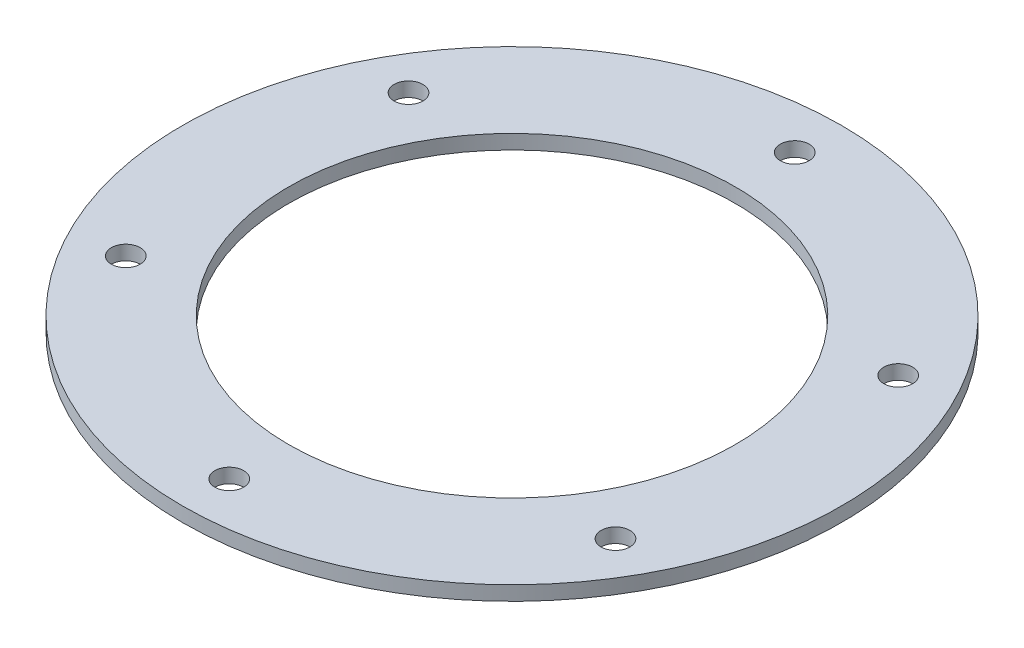
ISO-10303-21;
HEADER;
FILE_DESCRIPTION(('STEP AP214'),'2;1');
FILE_NAME('part.step','',(''),(''),'','','');
FILE_SCHEMA(('AUTOMOTIVE_DESIGN { 1 0 10303 214 1 1 1 1 }'));
ENDSEC;
DATA;
#1=APPLICATION_CONTEXT('core data for automotive mechanical design processes');
#2=APPLICATION_PROTOCOL_DEFINITION('international standard','automotive_design',2000,#1);
#3=PRODUCT_CONTEXT('',#1,'mechanical');
#4=PRODUCT('Part','Part','',(#3));
#5=PRODUCT_RELATED_PRODUCT_CATEGORY('part','',(#4));
#6=PRODUCT_DEFINITION_FORMATION('','',#4);
#7=PRODUCT_DEFINITION_CONTEXT('part definition',#1,'design');
#8=PRODUCT_DEFINITION('design','',#6,#7);
#9=PRODUCT_DEFINITION_SHAPE('','',#8);
#10=(LENGTH_UNIT() NAMED_UNIT(*) SI_UNIT(.MILLI.,.METRE.));
#11=(NAMED_UNIT(*) PLANE_ANGLE_UNIT() SI_UNIT($,.RADIAN.));
#12=(NAMED_UNIT(*) SI_UNIT($,.STERADIAN.) SOLID_ANGLE_UNIT());
#13=UNCERTAINTY_MEASURE_WITH_UNIT(LENGTH_MEASURE(1.E-05),#10,'distance_accuracy_value','');
#14=(GEOMETRIC_REPRESENTATION_CONTEXT(3) GLOBAL_UNCERTAINTY_ASSIGNED_CONTEXT((#13)) GLOBAL_UNIT_ASSIGNED_CONTEXT((#10,
#11,#12)) REPRESENTATION_CONTEXT('',''));
#15=CARTESIAN_POINT('',(0.,0.,0.));
#16=DIRECTION('',(0.,0.,1.));
#17=DIRECTION('',(1.,0.,0.));
#18=AXIS2_PLACEMENT_3D('',#15,#16,#17);
#19=CARTESIAN_POINT('',(0.,-1.,0.));
#20=DIRECTION('',(0.,1.,0.));
#21=DIRECTION('',(0.,0.,1.));
#22=AXIS2_PLACEMENT_3D('',#19,#20,#21);
#23=CYLINDRICAL_SURFACE('',#22,45.75);
#24=CARTESIAN_POINT('',(0.,-1.,0.));
#25=DIRECTION('',(0.,1.,0.));
#26=DIRECTION('',(0.,0.,1.));
#27=AXIS2_PLACEMENT_3D('',#24,#25,#26);
#28=CIRCLE('',#27,45.75);
#29=CARTESIAN_POINT('',(0.,-1.,45.75));
#30=VERTEX_POINT('',#29);
#31=EDGE_CURVE('E10',#30,#30,#28,.T.);
#32=ORIENTED_EDGE('',*,*,#31,.T.);
#33=EDGE_LOOP('',(#32));
#34=FACE_BOUND('',#33,.T.);
#35=CARTESIAN_POINT('',(0.,1.,0.));
#36=DIRECTION('',(0.,1.,0.));
#37=DIRECTION('',(0.,0.,1.));
#38=AXIS2_PLACEMENT_3D('',#35,#36,#37);
#39=CIRCLE('',#38,45.75);
#40=CARTESIAN_POINT('',(0.,1.,45.75));
#41=VERTEX_POINT('',#40);
#42=EDGE_CURVE('E40',#41,#41,#39,.T.);
#43=ORIENTED_EDGE('',*,*,#42,.F.);
#44=EDGE_LOOP('',(#43));
#45=FACE_BOUND('',#44,.T.);
#46=ADVANCED_FACE('F37',(#34,#45),#23,.T.);
#47=CARTESIAN_POINT('',(0.,-1.,0.));
#48=DIRECTION('',(0.,1.,0.));
#49=DIRECTION('',(0.,0.,1.));
#50=AXIS2_PLACEMENT_3D('',#47,#48,#49);
#51=PLANE('',#50);
#52=CARTESIAN_POINT('',(-33.9914970985392,-1.,-19.625));
#53=DIRECTION('',(0.,1.,0.));
#54=DIRECTION('',(0.,0.,1.));
#55=AXIS2_PLACEMENT_3D('',#52,#53,#54);
#56=CIRCLE('',#55,2.);
#57=CARTESIAN_POINT('',(-33.9914970985392,-1.,-17.625));
#58=VERTEX_POINT('',#57);
#59=EDGE_CURVE('E82',#58,#58,#56,.T.);
#60=ORIENTED_EDGE('',*,*,#59,.T.);
#61=EDGE_LOOP('',(#60));
#62=FACE_BOUND('',#61,.T.);
#63=CARTESIAN_POINT('',(-33.9914970985392,-1.,19.625));
#64=DIRECTION('',(0.,1.,0.));
#65=DIRECTION('',(0.,0.,1.));
#66=AXIS2_PLACEMENT_3D('',#63,#64,#65);
#67=CIRCLE('',#66,2.);
#68=CARTESIAN_POINT('',(-33.9914970985392,-1.,21.625));
#69=VERTEX_POINT('',#68);
#70=EDGE_CURVE('E76',#69,#69,#67,.T.);
#71=ORIENTED_EDGE('',*,*,#70,.T.);
#72=EDGE_LOOP('',(#71));
#73=FACE_BOUND('',#72,.T.);
#74=CARTESIAN_POINT('',(0.,-1.,39.25));
#75=DIRECTION('',(0.,1.,0.));
#76=DIRECTION('',(0.,0.,1.));
#77=AXIS2_PLACEMENT_3D('',#74,#75,#76);
#78=CIRCLE('',#77,2.);
#79=CARTESIAN_POINT('',(0.,-1.,41.25));
#80=VERTEX_POINT('',#79);
#81=EDGE_CURVE('E70',#80,#80,#78,.T.);
#82=ORIENTED_EDGE('',*,*,#81,.T.);
#83=EDGE_LOOP('',(#82));
#84=FACE_BOUND('',#83,.T.);
#85=CARTESIAN_POINT('',(33.9914970985392,-1.,19.625));
#86=DIRECTION('',(0.,1.,0.));
#87=DIRECTION('',(0.,0.,1.));
#88=AXIS2_PLACEMENT_3D('',#85,#86,#87);
#89=CIRCLE('',#88,2.);
#90=CARTESIAN_POINT('',(33.9914970985392,-1.,21.625));
#91=VERTEX_POINT('',#90);
#92=EDGE_CURVE('E64',#91,#91,#89,.T.);
#93=ORIENTED_EDGE('',*,*,#92,.T.);
#94=EDGE_LOOP('',(#93));
#95=FACE_BOUND('',#94,.T.);
#96=CARTESIAN_POINT('',(33.9914970985392,-1.,-19.625));
#97=DIRECTION('',(0.,1.,0.));
#98=DIRECTION('',(0.,0.,1.));
#99=AXIS2_PLACEMENT_3D('',#96,#97,#98);
#100=CIRCLE('',#99,2.);
#101=CARTESIAN_POINT('',(33.9914970985392,-1.,-17.625));
#102=VERTEX_POINT('',#101);
#103=EDGE_CURVE('E58',#102,#102,#100,.T.);
#104=ORIENTED_EDGE('',*,*,#103,.T.);
#105=EDGE_LOOP('',(#104));
#106=FACE_BOUND('',#105,.T.);
#107=CARTESIAN_POINT('',(0.,-1.,-39.25));
#108=DIRECTION('',(0.,1.,0.));
#109=DIRECTION('',(0.,0.,1.));
#110=AXIS2_PLACEMENT_3D('',#107,#108,#109);
#111=CIRCLE('',#110,2.);
#112=CARTESIAN_POINT('',(0.,-1.,-37.25));
#113=VERTEX_POINT('',#112);
#114=EDGE_CURVE('E52',#113,#113,#111,.T.);
#115=ORIENTED_EDGE('',*,*,#114,.T.);
#116=EDGE_LOOP('',(#115));
#117=FACE_BOUND('',#116,.T.);
#118=CARTESIAN_POINT('',(0.,-1.,0.));
#119=DIRECTION('',(0.,1.,0.));
#120=DIRECTION('',(0.,0.,1.));
#121=AXIS2_PLACEMENT_3D('',#118,#119,#120);
#122=CIRCLE('',#121,31.);
#123=CARTESIAN_POINT('',(0.,-1.,31.));
#124=VERTEX_POINT('',#123);
#125=EDGE_CURVE('E47',#124,#124,#122,.T.);
#126=ORIENTED_EDGE('',*,*,#125,.T.);
#127=EDGE_LOOP('',(#126));
#128=FACE_BOUND('',#127,.T.);
#129=ORIENTED_EDGE('',*,*,#31,.F.);
#130=EDGE_LOOP('',(#129));
#131=FACE_BOUND('',#130,.T.);
#132=ADVANCED_FACE('F91',(#62,#73,#84,#95,#106,#117,#128,#131),#51,.F.);
#133=CARTESIAN_POINT('',(0.,1.,0.));
#134=DIRECTION('',(0.,1.,0.));
#135=DIRECTION('',(0.,0.,1.));
#136=AXIS2_PLACEMENT_3D('',#133,#134,#135);
#137=PLANE('',#136);
#138=CARTESIAN_POINT('',(-33.9914970985392,1.,-19.625));
#139=DIRECTION('',(0.,1.,0.));
#140=DIRECTION('',(0.,0.,1.));
#141=AXIS2_PLACEMENT_3D('',#138,#139,#140);
#142=CIRCLE('',#141,2.);
#143=CARTESIAN_POINT('',(-33.9914970985392,1.,-17.625));
#144=VERTEX_POINT('',#143);
#145=EDGE_CURVE('E85',#144,#144,#142,.T.);
#146=ORIENTED_EDGE('',*,*,#145,.F.);
#147=EDGE_LOOP('',(#146));
#148=FACE_BOUND('',#147,.T.);
#149=CARTESIAN_POINT('',(-33.9914970985392,1.,19.625));
#150=DIRECTION('',(0.,1.,0.));
#151=DIRECTION('',(0.,0.,1.));
#152=AXIS2_PLACEMENT_3D('',#149,#150,#151);
#153=CIRCLE('',#152,2.);
#154=CARTESIAN_POINT('',(-33.9914970985392,1.,21.625));
#155=VERTEX_POINT('',#154);
#156=EDGE_CURVE('E79',#155,#155,#153,.T.);
#157=ORIENTED_EDGE('',*,*,#156,.F.);
#158=EDGE_LOOP('',(#157));
#159=FACE_BOUND('',#158,.T.);
#160=CARTESIAN_POINT('',(0.,1.,39.25));
#161=DIRECTION('',(0.,1.,0.));
#162=DIRECTION('',(0.,0.,1.));
#163=AXIS2_PLACEMENT_3D('',#160,#161,#162);
#164=CIRCLE('',#163,2.);
#165=CARTESIAN_POINT('',(0.,1.,41.25));
#166=VERTEX_POINT('',#165);
#167=EDGE_CURVE('E73',#166,#166,#164,.T.);
#168=ORIENTED_EDGE('',*,*,#167,.F.);
#169=EDGE_LOOP('',(#168));
#170=FACE_BOUND('',#169,.T.);
#171=CARTESIAN_POINT('',(33.9914970985392,1.,19.625));
#172=DIRECTION('',(0.,1.,0.));
#173=DIRECTION('',(0.,0.,1.));
#174=AXIS2_PLACEMENT_3D('',#171,#172,#173);
#175=CIRCLE('',#174,2.);
#176=CARTESIAN_POINT('',(33.9914970985392,1.,21.625));
#177=VERTEX_POINT('',#176);
#178=EDGE_CURVE('E67',#177,#177,#175,.T.);
#179=ORIENTED_EDGE('',*,*,#178,.F.);
#180=EDGE_LOOP('',(#179));
#181=FACE_BOUND('',#180,.T.);
#182=CARTESIAN_POINT('',(33.9914970985392,1.,-19.625));
#183=DIRECTION('',(0.,1.,0.));
#184=DIRECTION('',(0.,0.,1.));
#185=AXIS2_PLACEMENT_3D('',#182,#183,#184);
#186=CIRCLE('',#185,2.);
#187=CARTESIAN_POINT('',(33.9914970985392,1.,-17.625));
#188=VERTEX_POINT('',#187);
#189=EDGE_CURVE('E61',#188,#188,#186,.T.);
#190=ORIENTED_EDGE('',*,*,#189,.F.);
#191=EDGE_LOOP('',(#190));
#192=FACE_BOUND('',#191,.T.);
#193=CARTESIAN_POINT('',(0.,1.,-39.25));
#194=DIRECTION('',(0.,1.,0.));
#195=DIRECTION('',(0.,0.,1.));
#196=AXIS2_PLACEMENT_3D('',#193,#194,#195);
#197=CIRCLE('',#196,2.);
#198=CARTESIAN_POINT('',(0.,1.,-37.25));
#199=VERTEX_POINT('',#198);
#200=EDGE_CURVE('E55',#199,#199,#197,.T.);
#201=ORIENTED_EDGE('',*,*,#200,.F.);
#202=EDGE_LOOP('',(#201));
#203=FACE_BOUND('',#202,.T.);
#204=CARTESIAN_POINT('',(0.,1.,0.));
#205=DIRECTION('',(0.,1.,0.));
#206=DIRECTION('',(0.,0.,1.));
#207=AXIS2_PLACEMENT_3D('',#204,#205,#206);
#208=CIRCLE('',#207,31.);
#209=CARTESIAN_POINT('',(0.,1.,31.));
#210=VERTEX_POINT('',#209);
#211=EDGE_CURVE('E49',#210,#210,#208,.T.);
#212=ORIENTED_EDGE('',*,*,#211,.F.);
#213=EDGE_LOOP('',(#212));
#214=FACE_BOUND('',#213,.T.);
#215=ORIENTED_EDGE('',*,*,#42,.T.);
#216=EDGE_LOOP('',(#215));
#217=FACE_BOUND('',#216,.T.);
#218=ADVANCED_FACE('F101',(#148,#159,#170,#181,#192,#203,#214,#217),#137,.T.);
#219=CARTESIAN_POINT('',(0.,-1.,0.));
#220=DIRECTION('',(0.,1.,0.));
#221=DIRECTION('',(0.,0.,1.));
#222=AXIS2_PLACEMENT_3D('',#219,#220,#221);
#223=CYLINDRICAL_SURFACE('',#222,31.);
#224=ORIENTED_EDGE('',*,*,#125,.F.);
#225=EDGE_LOOP('',(#224));
#226=FACE_BOUND('',#225,.T.);
#227=ORIENTED_EDGE('',*,*,#211,.T.);
#228=EDGE_LOOP('',(#227));
#229=FACE_BOUND('',#228,.T.);
#230=ADVANCED_FACE('F104',(#226,#229),#223,.F.);
#231=CARTESIAN_POINT('',(0.,-1.,-39.25));
#232=DIRECTION('',(0.,1.,0.));
#233=DIRECTION('',(0.,0.,1.));
#234=AXIS2_PLACEMENT_3D('',#231,#232,#233);
#235=CYLINDRICAL_SURFACE('',#234,2.);
#236=ORIENTED_EDGE('',*,*,#114,.F.);
#237=EDGE_LOOP('',(#236));
#238=FACE_BOUND('',#237,.T.);
#239=ORIENTED_EDGE('',*,*,#200,.T.);
#240=EDGE_LOOP('',(#239));
#241=FACE_BOUND('',#240,.T.);
#242=ADVANCED_FACE('F129',(#238,#241),#235,.F.);
#243=CARTESIAN_POINT('',(33.9914970985392,-1.,-19.625));
#244=DIRECTION('',(0.,1.,0.));
#245=DIRECTION('',(0.,0.,1.));
#246=AXIS2_PLACEMENT_3D('',#243,#244,#245);
#247=CYLINDRICAL_SURFACE('',#246,2.);
#248=ORIENTED_EDGE('',*,*,#103,.F.);
#249=EDGE_LOOP('',(#248));
#250=FACE_BOUND('',#249,.T.);
#251=ORIENTED_EDGE('',*,*,#189,.T.);
#252=EDGE_LOOP('',(#251));
#253=FACE_BOUND('',#252,.T.);
#254=ADVANCED_FACE('F133',(#250,#253),#247,.F.);
#255=CARTESIAN_POINT('',(33.9914970985392,-1.,19.625));
#256=DIRECTION('',(0.,1.,0.));
#257=DIRECTION('',(0.,0.,1.));
#258=AXIS2_PLACEMENT_3D('',#255,#256,#257);
#259=CYLINDRICAL_SURFACE('',#258,2.);
#260=ORIENTED_EDGE('',*,*,#92,.F.);
#261=EDGE_LOOP('',(#260));
#262=FACE_BOUND('',#261,.T.);
#263=ORIENTED_EDGE('',*,*,#178,.T.);
#264=EDGE_LOOP('',(#263));
#265=FACE_BOUND('',#264,.T.);
#266=ADVANCED_FACE('F137',(#262,#265),#259,.F.);
#267=CARTESIAN_POINT('',(0.,-1.,39.25));
#268=DIRECTION('',(0.,1.,0.));
#269=DIRECTION('',(0.,0.,1.));
#270=AXIS2_PLACEMENT_3D('',#267,#268,#269);
#271=CYLINDRICAL_SURFACE('',#270,2.);
#272=ORIENTED_EDGE('',*,*,#81,.F.);
#273=EDGE_LOOP('',(#272));
#274=FACE_BOUND('',#273,.T.);
#275=ORIENTED_EDGE('',*,*,#167,.T.);
#276=EDGE_LOOP('',(#275));
#277=FACE_BOUND('',#276,.T.);
#278=ADVANCED_FACE('F141',(#274,#277),#271,.F.);
#279=CARTESIAN_POINT('',(-33.9914970985392,-1.,19.625));
#280=DIRECTION('',(0.,1.,0.));
#281=DIRECTION('',(0.,0.,1.));
#282=AXIS2_PLACEMENT_3D('',#279,#280,#281);
#283=CYLINDRICAL_SURFACE('',#282,2.);
#284=ORIENTED_EDGE('',*,*,#70,.F.);
#285=EDGE_LOOP('',(#284));
#286=FACE_BOUND('',#285,.T.);
#287=ORIENTED_EDGE('',*,*,#156,.T.);
#288=EDGE_LOOP('',(#287));
#289=FACE_BOUND('',#288,.T.);
#290=ADVANCED_FACE('F97',(#286,#289),#283,.F.);
#291=CARTESIAN_POINT('',(-33.9914970985392,-1.,-19.625));
#292=DIRECTION('',(0.,1.,0.));
#293=DIRECTION('',(0.,0.,1.));
#294=AXIS2_PLACEMENT_3D('',#291,#292,#293);
#295=CYLINDRICAL_SURFACE('',#294,2.);
#296=ORIENTED_EDGE('',*,*,#59,.F.);
#297=EDGE_LOOP('',(#296));
#298=FACE_BOUND('',#297,.T.);
#299=ORIENTED_EDGE('',*,*,#145,.T.);
#300=EDGE_LOOP('',(#299));
#301=FACE_BOUND('',#300,.T.);
#302=ADVANCED_FACE('F94',(#298,#301),#295,.F.);
#303=CLOSED_SHELL('',(#46,#132,#218,#230,#242,#254,#266,#278,#290,#302));
#304=MANIFOLD_SOLID_BREP('B2',#303);
#305=ADVANCED_BREP_SHAPE_REPRESENTATION('',(#18,#304),#14);
#306=SHAPE_DEFINITION_REPRESENTATION(#9,#305);
ENDSEC;
END-ISO-10303-21;
